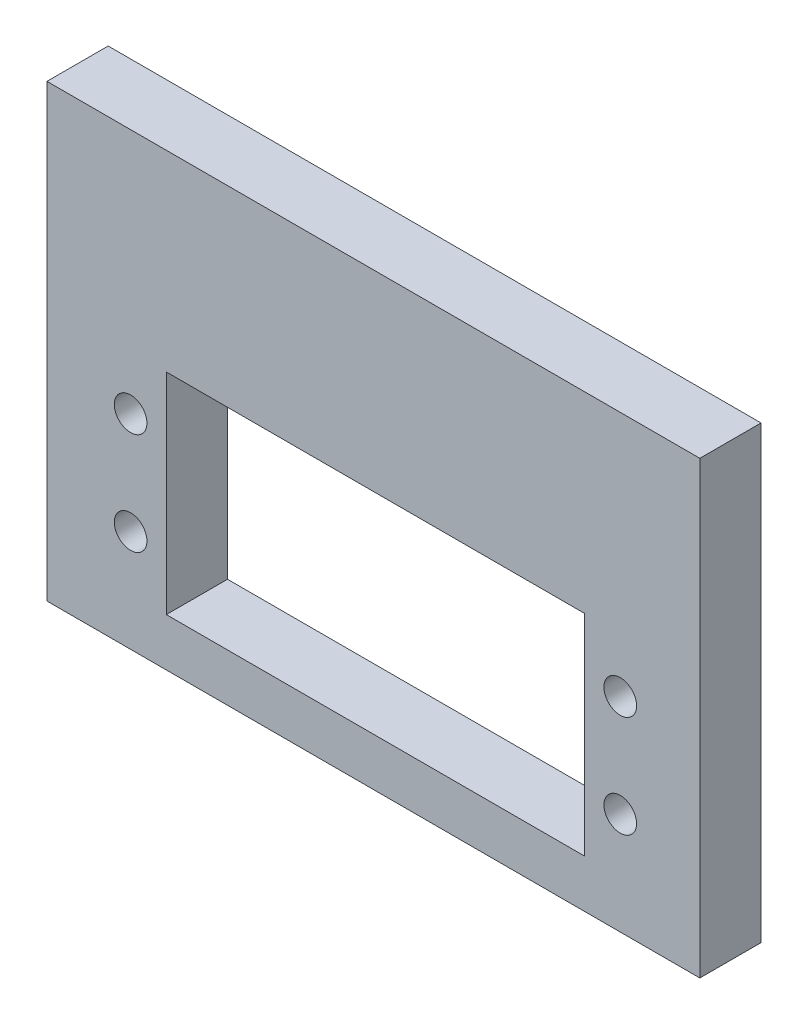
ISO-10303-21;
HEADER;
FILE_DESCRIPTION(('STEP AP214'),'2;1');
FILE_NAME('part.step','',(''),(''),'','','');
FILE_SCHEMA(('AUTOMOTIVE_DESIGN { 1 0 10303 214 1 1 1 1 }'));
ENDSEC;
DATA;
#1=APPLICATION_CONTEXT('core data for automotive mechanical design processes');
#2=APPLICATION_PROTOCOL_DEFINITION('international standard','automotive_design',2000,#1);
#3=PRODUCT_CONTEXT('',#1,'mechanical');
#4=PRODUCT('Part','Part','',(#3));
#5=PRODUCT_RELATED_PRODUCT_CATEGORY('part','',(#4));
#6=PRODUCT_DEFINITION_FORMATION('','',#4);
#7=PRODUCT_DEFINITION_CONTEXT('part definition',#1,'design');
#8=PRODUCT_DEFINITION('design','',#6,#7);
#9=PRODUCT_DEFINITION_SHAPE('','',#8);
#10=(LENGTH_UNIT() NAMED_UNIT(*) SI_UNIT(.MILLI.,.METRE.));
#11=(NAMED_UNIT(*) PLANE_ANGLE_UNIT() SI_UNIT($,.RADIAN.));
#12=(NAMED_UNIT(*) SI_UNIT($,.STERADIAN.) SOLID_ANGLE_UNIT());
#13=UNCERTAINTY_MEASURE_WITH_UNIT(LENGTH_MEASURE(1.E-05),#10,'distance_accuracy_value','');
#14=(GEOMETRIC_REPRESENTATION_CONTEXT(3) GLOBAL_UNCERTAINTY_ASSIGNED_CONTEXT((#13)) GLOBAL_UNIT_ASSIGNED_CONTEXT((#10,
#11,#12)) REPRESENTATION_CONTEXT('',''));
#15=CARTESIAN_POINT('',(0.,0.,0.));
#16=DIRECTION('',(0.,0.,1.));
#17=DIRECTION('',(1.,0.,0.));
#18=AXIS2_PLACEMENT_3D('',#15,#16,#17);
#19=CARTESIAN_POINT('',(0.,0.,6.));
#20=DIRECTION('',(0.,0.,1.));
#21=DIRECTION('',(1.,0.,0.));
#22=AXIS2_PLACEMENT_3D('',#19,#20,#21);
#23=PLANE('',#22);
#24=CARTESIAN_POINT('',(34.2,14.879727620077,6.));
#25=DIRECTION('',(0.,0.,1.));
#26=DIRECTION('',(1.,0.,0.));
#27=AXIS2_PLACEMENT_3D('',#24,#25,#26);
#28=CIRCLE('',#27,1.6);
#29=CARTESIAN_POINT('',(35.8,14.879727620077,6.));
#30=VERTEX_POINT('',#29);
#31=EDGE_CURVE('E252',#30,#30,#28,.T.);
#32=ORIENTED_EDGE('',*,*,#31,.F.);
#33=EDGE_LOOP('',(#32));
#34=FACE_BOUND('',#33,.T.);
#35=CARTESIAN_POINT('',(-13.8,14.879727620077,6.));
#36=DIRECTION('',(0.,0.,1.));
#37=DIRECTION('',(1.,0.,0.));
#38=AXIS2_PLACEMENT_3D('',#35,#36,#37);
#39=CIRCLE('',#38,1.6);
#40=CARTESIAN_POINT('',(-12.2,14.879727620077,6.));
#41=VERTEX_POINT('',#40);
#42=EDGE_CURVE('E133',#41,#41,#39,.T.);
#43=ORIENTED_EDGE('',*,*,#42,.F.);
#44=EDGE_LOOP('',(#43));
#45=FACE_BOUND('',#44,.T.);
#46=DIRECTION('',(0.,-1.,0.));
#47=VECTOR('',#46,1.);
#48=CARTESIAN_POINT('',(-22.,49.,6.));
#49=LINE('',#48,#47);
#50=CARTESIAN_POINT('',(-22.,49.,6.));
#51=VERTEX_POINT('',#50);
#52=CARTESIAN_POINT('',(-22.,4.87972762007696,6.));
#53=VERTEX_POINT('',#52);
#54=EDGE_CURVE('E142',#51,#53,#49,.T.);
#55=ORIENTED_EDGE('',*,*,#54,.T.);
#56=DIRECTION('',(1.,0.,0.));
#57=VECTOR('',#56,1.);
#58=CARTESIAN_POINT('',(-22.,4.87972762007696,6.));
#59=LINE('',#58,#57);
#60=CARTESIAN_POINT('',(42.,4.87972762007696,6.));
#61=VERTEX_POINT('',#60);
#62=EDGE_CURVE('E147',#53,#61,#59,.T.);
#63=ORIENTED_EDGE('',*,*,#62,.T.);
#64=DIRECTION('',(0.,1.,0.));
#65=VECTOR('',#64,1.);
#66=CARTESIAN_POINT('',(42.,4.87972762007696,6.));
#67=LINE('',#66,#65);
#68=CARTESIAN_POINT('',(42.,49.,6.));
#69=VERTEX_POINT('',#68);
#70=EDGE_CURVE('E146',#61,#69,#67,.T.);
#71=ORIENTED_EDGE('',*,*,#70,.T.);
#72=DIRECTION('',(-1.,0.,0.));
#73=VECTOR('',#72,1.);
#74=CARTESIAN_POINT('',(42.,49.,6.));
#75=LINE('',#74,#73);
#76=EDGE_CURVE('E152',#69,#51,#75,.T.);
#77=ORIENTED_EDGE('',*,*,#76,.T.);
#78=EDGE_LOOP('',(#55,#63,#71,#77));
#79=FACE_BOUND('',#78,.T.);
#80=DIRECTION('',(1.,0.,0.));
#81=VECTOR('',#80,1.);
#82=CARTESIAN_POINT('',(-10.3,9.57972762007696,6.));
#83=LINE('',#82,#81);
#84=CARTESIAN_POINT('',(-10.3,9.57972762007696,6.));
#85=VERTEX_POINT('',#84);
#86=CARTESIAN_POINT('',(30.7,9.57972762007696,6.));
#87=VERTEX_POINT('',#86);
#88=EDGE_CURVE('E115',#85,#87,#83,.T.);
#89=ORIENTED_EDGE('',*,*,#88,.F.);
#90=DIRECTION('',(0.,-1.,0.));
#91=VECTOR('',#90,1.);
#92=CARTESIAN_POINT('',(-10.3,30.179727620077,6.));
#93=LINE('',#92,#91);
#94=CARTESIAN_POINT('',(-10.3,30.179727620077,6.));
#95=VERTEX_POINT('',#94);
#96=EDGE_CURVE('E101',#95,#85,#93,.T.);
#97=ORIENTED_EDGE('',*,*,#96,.F.);
#98=DIRECTION('',(-1.,0.,0.));
#99=VECTOR('',#98,1.);
#100=CARTESIAN_POINT('',(30.7,30.179727620077,6.));
#101=LINE('',#100,#99);
#102=CARTESIAN_POINT('',(30.7,30.179727620077,6.));
#103=VERTEX_POINT('',#102);
#104=EDGE_CURVE('E130',#103,#95,#101,.T.);
#105=ORIENTED_EDGE('',*,*,#104,.F.);
#106=DIRECTION('',(0.,1.,0.));
#107=VECTOR('',#106,1.);
#108=CARTESIAN_POINT('',(30.7,9.57972762007696,6.));
#109=LINE('',#108,#107);
#110=EDGE_CURVE('E124',#87,#103,#109,.T.);
#111=ORIENTED_EDGE('',*,*,#110,.F.);
#112=EDGE_LOOP('',(#89,#97,#105,#111));
#113=FACE_BOUND('',#112,.T.);
#114=CARTESIAN_POINT('',(-13.8,24.879727620077,6.));
#115=DIRECTION('',(0.,0.,1.));
#116=DIRECTION('',(1.,0.,0.));
#117=AXIS2_PLACEMENT_3D('',#114,#115,#116);
#118=CIRCLE('',#117,1.6);
#119=CARTESIAN_POINT('',(-12.2,24.879727620077,6.));
#120=VERTEX_POINT('',#119);
#121=EDGE_CURVE('E257',#120,#120,#118,.T.);
#122=ORIENTED_EDGE('',*,*,#121,.F.);
#123=EDGE_LOOP('',(#122));
#124=FACE_BOUND('',#123,.T.);
#125=CARTESIAN_POINT('',(34.2,24.879727620077,6.));
#126=DIRECTION('',(0.,0.,1.));
#127=DIRECTION('',(1.,0.,0.));
#128=AXIS2_PLACEMENT_3D('',#125,#126,#127);
#129=CIRCLE('',#128,1.6);
#130=CARTESIAN_POINT('',(35.8,24.879727620077,6.));
#131=VERTEX_POINT('',#130);
#132=EDGE_CURVE('E244',#131,#131,#129,.T.);
#133=ORIENTED_EDGE('',*,*,#132,.F.);
#134=EDGE_LOOP('',(#133));
#135=FACE_BOUND('',#134,.T.);
#136=ADVANCED_FACE('F39',(#34,#45,#79,#113,#124,#135),#23,.T.);
#137=CARTESIAN_POINT('',(0.,0.,0.));
#138=DIRECTION('',(0.,0.,1.));
#139=DIRECTION('',(1.,0.,0.));
#140=AXIS2_PLACEMENT_3D('',#137,#138,#139);
#141=PLANE('',#140);
#142=DIRECTION('',(0.,-1.,0.));
#143=VECTOR('',#142,1.);
#144=CARTESIAN_POINT('',(-22.,49.,0.));
#145=LINE('',#144,#143);
#146=CARTESIAN_POINT('',(-22.,49.,0.));
#147=VERTEX_POINT('',#146);
#148=CARTESIAN_POINT('',(-22.,4.87972762007696,0.));
#149=VERTEX_POINT('',#148);
#150=EDGE_CURVE('E118',#147,#149,#145,.T.);
#151=ORIENTED_EDGE('',*,*,#150,.F.);
#152=DIRECTION('',(-1.,0.,0.));
#153=VECTOR('',#152,1.);
#154=CARTESIAN_POINT('',(42.,49.,0.));
#155=LINE('',#154,#153);
#156=CARTESIAN_POINT('',(42.,49.,0.));
#157=VERTEX_POINT('',#156);
#158=EDGE_CURVE('E150',#157,#147,#155,.T.);
#159=ORIENTED_EDGE('',*,*,#158,.F.);
#160=DIRECTION('',(0.,1.,0.));
#161=VECTOR('',#160,1.);
#162=CARTESIAN_POINT('',(42.,4.87972762007696,0.));
#163=LINE('',#162,#161);
#164=CARTESIAN_POINT('',(42.,4.87972762007696,0.));
#165=VERTEX_POINT('',#164);
#166=EDGE_CURVE('E156',#165,#157,#163,.T.);
#167=ORIENTED_EDGE('',*,*,#166,.F.);
#168=DIRECTION('',(1.,0.,0.));
#169=VECTOR('',#168,1.);
#170=CARTESIAN_POINT('',(-22.,4.87972762007696,0.));
#171=LINE('',#170,#169);
#172=EDGE_CURVE('E157',#149,#165,#171,.T.);
#173=ORIENTED_EDGE('',*,*,#172,.F.);
#174=EDGE_LOOP('',(#151,#159,#167,#173));
#175=FACE_BOUND('',#174,.T.);
#176=DIRECTION('',(0.,-1.,0.));
#177=VECTOR('',#176,1.);
#178=CARTESIAN_POINT('',(-10.3,30.179727620077,0.));
#179=LINE('',#178,#177);
#180=CARTESIAN_POINT('',(-10.3,30.179727620077,0.));
#181=VERTEX_POINT('',#180);
#182=CARTESIAN_POINT('',(-10.3,9.57972762007696,0.));
#183=VERTEX_POINT('',#182);
#184=EDGE_CURVE('E64',#181,#183,#179,.T.);
#185=ORIENTED_EDGE('',*,*,#184,.T.);
#186=DIRECTION('',(1.,0.,0.));
#187=VECTOR('',#186,1.);
#188=CARTESIAN_POINT('',(-10.3,9.57972762007696,0.));
#189=LINE('',#188,#187);
#190=CARTESIAN_POINT('',(30.7,9.57972762007696,0.));
#191=VERTEX_POINT('',#190);
#192=EDGE_CURVE('E116',#183,#191,#189,.T.);
#193=ORIENTED_EDGE('',*,*,#192,.T.);
#194=DIRECTION('',(0.,1.,0.));
#195=VECTOR('',#194,1.);
#196=CARTESIAN_POINT('',(30.7,9.57972762007696,0.));
#197=LINE('',#196,#195);
#198=CARTESIAN_POINT('',(30.7,30.179727620077,0.));
#199=VERTEX_POINT('',#198);
#200=EDGE_CURVE('E134',#191,#199,#197,.T.);
#201=ORIENTED_EDGE('',*,*,#200,.T.);
#202=DIRECTION('',(-1.,0.,0.));
#203=VECTOR('',#202,1.);
#204=CARTESIAN_POINT('',(30.7,30.179727620077,0.));
#205=LINE('',#204,#203);
#206=EDGE_CURVE('E111',#199,#181,#205,.T.);
#207=ORIENTED_EDGE('',*,*,#206,.T.);
#208=EDGE_LOOP('',(#185,#193,#201,#207));
#209=FACE_BOUND('',#208,.T.);
#210=CARTESIAN_POINT('',(-13.8,14.879727620077,0.));
#211=DIRECTION('',(0.,0.,1.));
#212=DIRECTION('',(1.,0.,0.));
#213=AXIS2_PLACEMENT_3D('',#210,#211,#212);
#214=CIRCLE('',#213,1.6);
#215=CARTESIAN_POINT('',(-12.2,14.879727620077,0.));
#216=VERTEX_POINT('',#215);
#217=EDGE_CURVE('E259',#216,#216,#214,.T.);
#218=ORIENTED_EDGE('',*,*,#217,.T.);
#219=EDGE_LOOP('',(#218));
#220=FACE_BOUND('',#219,.T.);
#221=CARTESIAN_POINT('',(-13.8,24.879727620077,0.));
#222=DIRECTION('',(0.,0.,1.));
#223=DIRECTION('',(1.,0.,0.));
#224=AXIS2_PLACEMENT_3D('',#221,#222,#223);
#225=CIRCLE('',#224,1.6);
#226=CARTESIAN_POINT('',(-12.2,24.879727620077,0.));
#227=VERTEX_POINT('',#226);
#228=EDGE_CURVE('E251',#227,#227,#225,.T.);
#229=ORIENTED_EDGE('',*,*,#228,.T.);
#230=EDGE_LOOP('',(#229));
#231=FACE_BOUND('',#230,.T.);
#232=CARTESIAN_POINT('',(34.2,14.879727620077,0.));
#233=DIRECTION('',(0.,0.,1.));
#234=DIRECTION('',(1.,0.,0.));
#235=AXIS2_PLACEMENT_3D('',#232,#233,#234);
#236=CIRCLE('',#235,1.6);
#237=CARTESIAN_POINT('',(35.8,14.879727620077,0.));
#238=VERTEX_POINT('',#237);
#239=EDGE_CURVE('E246',#238,#238,#236,.T.);
#240=ORIENTED_EDGE('',*,*,#239,.T.);
#241=EDGE_LOOP('',(#240));
#242=FACE_BOUND('',#241,.T.);
#243=CARTESIAN_POINT('',(34.2,24.879727620077,0.));
#244=DIRECTION('',(0.,0.,1.));
#245=DIRECTION('',(1.,0.,0.));
#246=AXIS2_PLACEMENT_3D('',#243,#244,#245);
#247=CIRCLE('',#246,1.6);
#248=CARTESIAN_POINT('',(35.8,24.879727620077,0.));
#249=VERTEX_POINT('',#248);
#250=EDGE_CURVE('E243',#249,#249,#247,.T.);
#251=ORIENTED_EDGE('',*,*,#250,.T.);
#252=EDGE_LOOP('',(#251));
#253=FACE_BOUND('',#252,.T.);
#254=ADVANCED_FACE('F176',(#175,#209,#220,#231,#242,#253),#141,.F.);
#255=CARTESIAN_POINT('',(-22.,49.,6.));
#256=DIRECTION('',(1.,0.,0.));
#257=DIRECTION('',(0.,0.,-1.));
#258=AXIS2_PLACEMENT_3D('',#255,#256,#257);
#259=PLANE('',#258);
#260=ORIENTED_EDGE('',*,*,#150,.T.);
#261=DIRECTION('',(0.,0.,-1.));
#262=VECTOR('',#261,1.);
#263=CARTESIAN_POINT('',(-22.,4.87972762007696,6.));
#264=LINE('',#263,#262);
#265=EDGE_CURVE('E11',#53,#149,#264,.T.);
#266=ORIENTED_EDGE('',*,*,#265,.F.);
#267=ORIENTED_EDGE('',*,*,#54,.F.);
#268=DIRECTION('',(0.,0.,-1.));
#269=VECTOR('',#268,1.);
#270=CARTESIAN_POINT('',(-22.,49.,6.));
#271=LINE('',#270,#269);
#272=EDGE_CURVE('E155',#51,#147,#271,.T.);
#273=ORIENTED_EDGE('',*,*,#272,.T.);
#274=EDGE_LOOP('',(#260,#266,#267,#273));
#275=FACE_BOUND('',#274,.T.);
#276=ADVANCED_FACE('F41',(#275),#259,.F.);
#277=CARTESIAN_POINT('',(-22.,4.87972762007696,6.));
#278=DIRECTION('',(0.,1.,0.));
#279=DIRECTION('',(0.,0.,1.));
#280=AXIS2_PLACEMENT_3D('',#277,#278,#279);
#281=PLANE('',#280);
#282=ORIENTED_EDGE('',*,*,#172,.T.);
#283=DIRECTION('',(0.,0.,-1.));
#284=VECTOR('',#283,1.);
#285=CARTESIAN_POINT('',(42.,4.87972762007696,6.));
#286=LINE('',#285,#284);
#287=EDGE_CURVE('E50',#61,#165,#286,.T.);
#288=ORIENTED_EDGE('',*,*,#287,.F.);
#289=ORIENTED_EDGE('',*,*,#62,.F.);
#290=ORIENTED_EDGE('',*,*,#265,.T.);
#291=EDGE_LOOP('',(#282,#288,#289,#290));
#292=FACE_BOUND('',#291,.T.);
#293=ADVANCED_FACE('F186',(#292),#281,.F.);
#294=CARTESIAN_POINT('',(42.,4.87972762007696,6.));
#295=DIRECTION('',(-1.,0.,0.));
#296=DIRECTION('',(0.,0.,1.));
#297=AXIS2_PLACEMENT_3D('',#294,#295,#296);
#298=PLANE('',#297);
#299=ORIENTED_EDGE('',*,*,#166,.T.);
#300=DIRECTION('',(0.,0.,-1.));
#301=VECTOR('',#300,1.);
#302=CARTESIAN_POINT('',(42.,49.,6.));
#303=LINE('',#302,#301);
#304=EDGE_CURVE('E165',#69,#157,#303,.T.);
#305=ORIENTED_EDGE('',*,*,#304,.F.);
#306=ORIENTED_EDGE('',*,*,#70,.F.);
#307=ORIENTED_EDGE('',*,*,#287,.T.);
#308=EDGE_LOOP('',(#299,#305,#306,#307));
#309=FACE_BOUND('',#308,.T.);
#310=ADVANCED_FACE('F169',(#309),#298,.F.);
#311=CARTESIAN_POINT('',(42.,49.,6.));
#312=DIRECTION('',(0.,-1.,0.));
#313=DIRECTION('',(0.,0.,-1.));
#314=AXIS2_PLACEMENT_3D('',#311,#312,#313);
#315=PLANE('',#314);
#316=ORIENTED_EDGE('',*,*,#158,.T.);
#317=ORIENTED_EDGE('',*,*,#272,.F.);
#318=ORIENTED_EDGE('',*,*,#76,.F.);
#319=ORIENTED_EDGE('',*,*,#304,.T.);
#320=EDGE_LOOP('',(#316,#317,#318,#319));
#321=FACE_BOUND('',#320,.T.);
#322=ADVANCED_FACE('F179',(#321),#315,.F.);
#323=CARTESIAN_POINT('',(-10.3,30.179727620077,6.));
#324=DIRECTION('',(1.,0.,0.));
#325=DIRECTION('',(0.,0.,-1.));
#326=AXIS2_PLACEMENT_3D('',#323,#324,#325);
#327=PLANE('',#326);
#328=ORIENTED_EDGE('',*,*,#184,.F.);
#329=DIRECTION('',(0.,0.,-1.));
#330=VECTOR('',#329,1.);
#331=CARTESIAN_POINT('',(-10.3,30.179727620077,6.));
#332=LINE('',#331,#330);
#333=EDGE_CURVE('E110',#95,#181,#332,.T.);
#334=ORIENTED_EDGE('',*,*,#333,.F.);
#335=ORIENTED_EDGE('',*,*,#96,.T.);
#336=DIRECTION('',(0.,0.,-1.));
#337=VECTOR('',#336,1.);
#338=CARTESIAN_POINT('',(-10.3,9.57972762007696,6.));
#339=LINE('',#338,#337);
#340=EDGE_CURVE('E109',#85,#183,#339,.T.);
#341=ORIENTED_EDGE('',*,*,#340,.T.);
#342=EDGE_LOOP('',(#328,#334,#335,#341));
#343=FACE_BOUND('',#342,.T.);
#344=ADVANCED_FACE('F107',(#343),#327,.T.);
#345=CARTESIAN_POINT('',(-10.3,9.57972762007696,6.));
#346=DIRECTION('',(0.,1.,0.));
#347=DIRECTION('',(0.,0.,1.));
#348=AXIS2_PLACEMENT_3D('',#345,#346,#347);
#349=PLANE('',#348);
#350=ORIENTED_EDGE('',*,*,#192,.F.);
#351=ORIENTED_EDGE('',*,*,#340,.F.);
#352=ORIENTED_EDGE('',*,*,#88,.T.);
#353=DIRECTION('',(0.,0.,-1.));
#354=VECTOR('',#353,1.);
#355=CARTESIAN_POINT('',(30.7,9.57972762007696,6.));
#356=LINE('',#355,#354);
#357=EDGE_CURVE('E123',#87,#191,#356,.T.);
#358=ORIENTED_EDGE('',*,*,#357,.T.);
#359=EDGE_LOOP('',(#350,#351,#352,#358));
#360=FACE_BOUND('',#359,.T.);
#361=ADVANCED_FACE('F117',(#360),#349,.T.);
#362=CARTESIAN_POINT('',(30.7,9.57972762007696,6.));
#363=DIRECTION('',(-1.,0.,0.));
#364=DIRECTION('',(0.,0.,1.));
#365=AXIS2_PLACEMENT_3D('',#362,#363,#364);
#366=PLANE('',#365);
#367=ORIENTED_EDGE('',*,*,#200,.F.);
#368=ORIENTED_EDGE('',*,*,#357,.F.);
#369=ORIENTED_EDGE('',*,*,#110,.T.);
#370=DIRECTION('',(0.,0.,-1.));
#371=VECTOR('',#370,1.);
#372=CARTESIAN_POINT('',(30.7,30.179727620077,6.));
#373=LINE('',#372,#371);
#374=EDGE_CURVE('E53',#103,#199,#373,.T.);
#375=ORIENTED_EDGE('',*,*,#374,.T.);
#376=EDGE_LOOP('',(#367,#368,#369,#375));
#377=FACE_BOUND('',#376,.T.);
#378=ADVANCED_FACE('F212',(#377),#366,.T.);
#379=CARTESIAN_POINT('',(30.7,30.179727620077,6.));
#380=DIRECTION('',(0.,-1.,0.));
#381=DIRECTION('',(0.,0.,-1.));
#382=AXIS2_PLACEMENT_3D('',#379,#380,#381);
#383=PLANE('',#382);
#384=ORIENTED_EDGE('',*,*,#206,.F.);
#385=ORIENTED_EDGE('',*,*,#374,.F.);
#386=ORIENTED_EDGE('',*,*,#104,.T.);
#387=ORIENTED_EDGE('',*,*,#333,.T.);
#388=EDGE_LOOP('',(#384,#385,#386,#387));
#389=FACE_BOUND('',#388,.T.);
#390=ADVANCED_FACE('F218',(#389),#383,.T.);
#391=CARTESIAN_POINT('',(-13.8,14.879727620077,6.));
#392=DIRECTION('',(0.,0.,-1.));
#393=DIRECTION('',(-1.,0.,0.));
#394=AXIS2_PLACEMENT_3D('',#391,#392,#393);
#395=CYLINDRICAL_SURFACE('',#394,1.6);
#396=ORIENTED_EDGE('',*,*,#42,.T.);
#397=EDGE_LOOP('',(#396));
#398=FACE_BOUND('',#397,.T.);
#399=ORIENTED_EDGE('',*,*,#217,.F.);
#400=EDGE_LOOP('',(#399));
#401=FACE_BOUND('',#400,.T.);
#402=ADVANCED_FACE('F225',(#398,#401),#395,.F.);
#403=CARTESIAN_POINT('',(-13.8,24.879727620077,6.));
#404=DIRECTION('',(0.,0.,-1.));
#405=DIRECTION('',(-1.,0.,0.));
#406=AXIS2_PLACEMENT_3D('',#403,#404,#405);
#407=CYLINDRICAL_SURFACE('',#406,1.6);
#408=ORIENTED_EDGE('',*,*,#121,.T.);
#409=EDGE_LOOP('',(#408));
#410=FACE_BOUND('',#409,.T.);
#411=ORIENTED_EDGE('',*,*,#228,.F.);
#412=EDGE_LOOP('',(#411));
#413=FACE_BOUND('',#412,.T.);
#414=ADVANCED_FACE('F224',(#410,#413),#407,.F.);
#415=CARTESIAN_POINT('',(34.2,14.879727620077,6.));
#416=DIRECTION('',(0.,0.,-1.));
#417=DIRECTION('',(-1.,0.,0.));
#418=AXIS2_PLACEMENT_3D('',#415,#416,#417);
#419=CYLINDRICAL_SURFACE('',#418,1.6);
#420=ORIENTED_EDGE('',*,*,#31,.T.);
#421=EDGE_LOOP('',(#420));
#422=FACE_BOUND('',#421,.T.);
#423=ORIENTED_EDGE('',*,*,#239,.F.);
#424=EDGE_LOOP('',(#423));
#425=FACE_BOUND('',#424,.T.);
#426=ADVANCED_FACE('F227',(#422,#425),#419,.F.);
#427=CARTESIAN_POINT('',(34.2,24.879727620077,6.));
#428=DIRECTION('',(0.,0.,-1.));
#429=DIRECTION('',(-1.,0.,0.));
#430=AXIS2_PLACEMENT_3D('',#427,#428,#429);
#431=CYLINDRICAL_SURFACE('',#430,1.6);
#432=ORIENTED_EDGE('',*,*,#132,.T.);
#433=EDGE_LOOP('',(#432));
#434=FACE_BOUND('',#433,.T.);
#435=ORIENTED_EDGE('',*,*,#250,.F.);
#436=EDGE_LOOP('',(#435));
#437=FACE_BOUND('',#436,.T.);
#438=ADVANCED_FACE('F232',(#434,#437),#431,.F.);
#439=CLOSED_SHELL('',(#136,#254,#276,#293,#310,#322,#344,#361,#378,#390,#402,#414,#426,#438));
#440=MANIFOLD_SOLID_BREP('B2',#439);
#441=ADVANCED_BREP_SHAPE_REPRESENTATION('',(#18,#440),#14);
#442=SHAPE_DEFINITION_REPRESENTATION(#9,#441);
ENDSEC;
END-ISO-10303-21;
